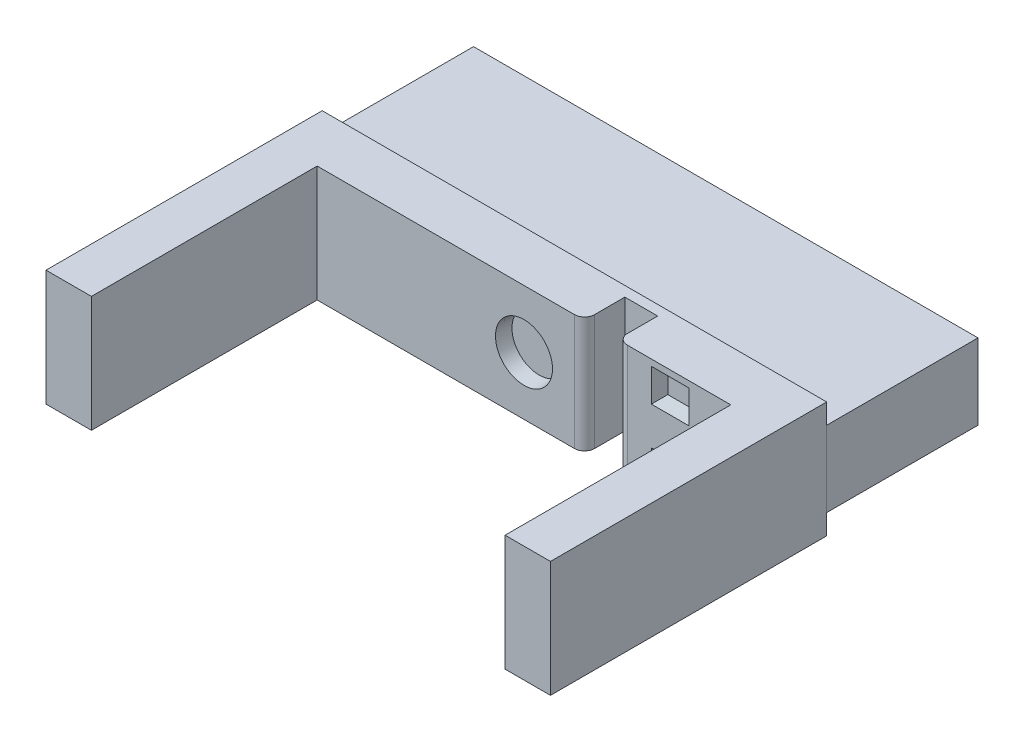
ISO-10303-21;
HEADER;
FILE_DESCRIPTION(('STEP AP214'),'2;1');
FILE_NAME('part.step','',(''),(''),'','','');
FILE_SCHEMA(('AUTOMOTIVE_DESIGN { 1 0 10303 214 1 1 1 1 }'));
ENDSEC;
DATA;
#1=APPLICATION_CONTEXT('core data for automotive mechanical design processes');
#2=APPLICATION_PROTOCOL_DEFINITION('international standard','automotive_design',2000,#1);
#3=PRODUCT_CONTEXT('',#1,'mechanical');
#4=PRODUCT('Part','Part','',(#3));
#5=PRODUCT_RELATED_PRODUCT_CATEGORY('part','',(#4));
#6=PRODUCT_DEFINITION_FORMATION('','',#4);
#7=PRODUCT_DEFINITION_CONTEXT('part definition',#1,'design');
#8=PRODUCT_DEFINITION('design','',#6,#7);
#9=PRODUCT_DEFINITION_SHAPE('','',#8);
#10=(LENGTH_UNIT() NAMED_UNIT(*) SI_UNIT(.MILLI.,.METRE.));
#11=(NAMED_UNIT(*) PLANE_ANGLE_UNIT() SI_UNIT($,.RADIAN.));
#12=(NAMED_UNIT(*) SI_UNIT($,.STERADIAN.) SOLID_ANGLE_UNIT());
#13=UNCERTAINTY_MEASURE_WITH_UNIT(LENGTH_MEASURE(1.E-05),#10,'distance_accuracy_value','');
#14=(GEOMETRIC_REPRESENTATION_CONTEXT(3) GLOBAL_UNCERTAINTY_ASSIGNED_CONTEXT((#13)) GLOBAL_UNIT_ASSIGNED_CONTEXT((#10,
#11,#12)) REPRESENTATION_CONTEXT('',''));
#15=CARTESIAN_POINT('',(0.,0.,0.));
#16=DIRECTION('',(0.,0.,1.));
#17=DIRECTION('',(1.,0.,0.));
#18=AXIS2_PLACEMENT_3D('',#15,#16,#17);
#19=CARTESIAN_POINT('',(0.,0.,40.));
#20=DIRECTION('',(0.,0.,1.));
#21=DIRECTION('',(1.,0.,0.));
#22=AXIS2_PLACEMENT_3D('',#19,#20,#21);
#23=PLANE('',#22);
#24=CARTESIAN_POINT('',(50.,-7.50000000000002,40.));
#25=DIRECTION('',(0.,0.,1.));
#26=DIRECTION('',(1.,0.,0.));
#27=AXIS2_PLACEMENT_3D('',#24,#25,#26);
#28=CIRCLE('',#27,5.64999999999999);
#29=CARTESIAN_POINT('',(55.65,-7.50000000000002,40.));
#30=VERTEX_POINT('',#29);
#31=EDGE_CURVE('E221',#30,#30,#28,.T.);
#32=ORIENTED_EDGE('',*,*,#31,.F.);
#33=EDGE_LOOP('',(#32));
#34=FACE_BOUND('',#33,.T.);
#35=DIRECTION('',(-1.,0.,0.));
#36=VECTOR('',#35,1.);
#37=CARTESIAN_POINT('',(100.,4.,40.));
#38=LINE('',#37,#36);
#39=CARTESIAN_POINT('',(60.,3.99999999999999,40.));
#40=VERTEX_POINT('',#39);
#41=CARTESIAN_POINT('',(9.00000000000001,3.99999999999999,40.));
#42=VERTEX_POINT('',#41);
#43=EDGE_CURVE('E332',#40,#42,#38,.T.);
#44=ORIENTED_EDGE('',*,*,#43,.T.);
#45=DIRECTION('',(0.,1.,0.));
#46=VECTOR('',#45,1.);
#47=CARTESIAN_POINT('',(9.,-19.,40.));
#48=LINE('',#47,#46);
#49=CARTESIAN_POINT('',(8.99999999999999,-19.,40.));
#50=VERTEX_POINT('',#49);
#51=EDGE_CURVE('E246',#50,#42,#48,.T.);
#52=ORIENTED_EDGE('',*,*,#51,.F.);
#53=DIRECTION('',(1.,0.,0.));
#54=VECTOR('',#53,1.);
#55=CARTESIAN_POINT('',(100.,-19.,40.));
#56=LINE('',#55,#54);
#57=CARTESIAN_POINT('',(60.,-19.,40.));
#58=VERTEX_POINT('',#57);
#59=EDGE_CURVE('E333',#50,#58,#56,.T.);
#60=ORIENTED_EDGE('',*,*,#59,.T.);
#61=DIRECTION('',(0.,-1.,0.));
#62=VECTOR('',#61,1.);
#63=CARTESIAN_POINT('',(60.,3.99999999999999,40.));
#64=LINE('',#63,#62);
#65=EDGE_CURVE('E363',#58,#40,#64,.F.);
#66=ORIENTED_EDGE('',*,*,#65,.T.);
#67=EDGE_LOOP('',(#44,#52,#60,#66));
#68=FACE_BOUND('',#67,.T.);
#69=ADVANCED_FACE('F43',(#34,#68),#23,.T.);
#70=DIRECTION('',(0.,-1.,0.));
#71=VECTOR('',#70,1.);
#72=CARTESIAN_POINT('',(75.25,-17.75,40.));
#73=LINE('',#72,#71);
#74=CARTESIAN_POINT('',(75.25,-11.25,40.));
#75=VERTEX_POINT('',#74);
#76=CARTESIAN_POINT('',(75.25,-17.75,40.));
#77=VERTEX_POINT('',#76);
#78=EDGE_CURVE('E58',#75,#77,#73,.T.);
#79=ORIENTED_EDGE('',*,*,#78,.F.);
#80=DIRECTION('',(-1.,0.,0.));
#81=VECTOR('',#80,1.);
#82=CARTESIAN_POINT('',(75.25,-11.25,40.));
#83=LINE('',#82,#81);
#84=CARTESIAN_POINT('',(82.75,-11.25,40.));
#85=VERTEX_POINT('',#84);
#86=EDGE_CURVE('E213',#85,#75,#83,.T.);
#87=ORIENTED_EDGE('',*,*,#86,.F.);
#88=DIRECTION('',(0.,1.,0.));
#89=VECTOR('',#88,1.);
#90=CARTESIAN_POINT('',(82.75,-17.75,40.));
#91=LINE('',#90,#89);
#92=CARTESIAN_POINT('',(82.75,-17.75,40.));
#93=VERTEX_POINT('',#92);
#94=EDGE_CURVE('E195',#93,#85,#91,.T.);
#95=ORIENTED_EDGE('',*,*,#94,.F.);
#96=DIRECTION('',(1.,0.,0.));
#97=VECTOR('',#96,1.);
#98=CARTESIAN_POINT('',(75.25,-17.75,40.));
#99=LINE('',#98,#97);
#100=EDGE_CURVE('E206',#77,#93,#99,.T.);
#101=ORIENTED_EDGE('',*,*,#100,.F.);
#102=EDGE_LOOP('',(#79,#87,#95,#101));
#103=FACE_BOUND('',#102,.T.);
#104=DIRECTION('',(0.,-1.,0.));
#105=VECTOR('',#104,1.);
#106=CARTESIAN_POINT('',(75.25,-3.75,40.));
#107=LINE('',#106,#105);
#108=CARTESIAN_POINT('',(75.25,2.75,40.));
#109=VERTEX_POINT('',#108);
#110=CARTESIAN_POINT('',(75.25,-3.75,40.));
#111=VERTEX_POINT('',#110);
#112=EDGE_CURVE('E66',#109,#111,#107,.T.);
#113=ORIENTED_EDGE('',*,*,#112,.F.);
#114=DIRECTION('',(-1.,0.,0.));
#115=VECTOR('',#114,1.);
#116=CARTESIAN_POINT('',(75.25,2.75,40.));
#117=LINE('',#116,#115);
#118=CARTESIAN_POINT('',(82.75,2.75,40.));
#119=VERTEX_POINT('',#118);
#120=EDGE_CURVE('E240',#119,#109,#117,.T.);
#121=ORIENTED_EDGE('',*,*,#120,.F.);
#122=DIRECTION('',(0.,1.,0.));
#123=VECTOR('',#122,1.);
#124=CARTESIAN_POINT('',(82.75,-3.75,40.));
#125=LINE('',#124,#123);
#126=CARTESIAN_POINT('',(82.75,-3.75,40.));
#127=VERTEX_POINT('',#126);
#128=EDGE_CURVE('E237',#127,#119,#125,.T.);
#129=ORIENTED_EDGE('',*,*,#128,.F.);
#130=DIRECTION('',(1.,0.,0.));
#131=VECTOR('',#130,1.);
#132=CARTESIAN_POINT('',(75.25,-3.75,40.));
#133=LINE('',#132,#131);
#134=EDGE_CURVE('E233',#111,#127,#133,.T.);
#135=ORIENTED_EDGE('',*,*,#134,.F.);
#136=EDGE_LOOP('',(#113,#121,#129,#135));
#137=FACE_BOUND('',#136,.T.);
#138=CARTESIAN_POINT('',(70.5,-19.,40.));
#139=VERTEX_POINT('',#138);
#140=CARTESIAN_POINT('',(91.,-19.,40.));
#141=VERTEX_POINT('',#140);
#142=EDGE_CURVE('E331',#139,#141,#56,.T.);
#143=ORIENTED_EDGE('',*,*,#142,.T.);
#144=DIRECTION('',(0.,-1.,0.));
#145=VECTOR('',#144,1.);
#146=CARTESIAN_POINT('',(91.,-19.,40.));
#147=LINE('',#146,#145);
#148=CARTESIAN_POINT('',(91.,4.,40.));
#149=VERTEX_POINT('',#148);
#150=EDGE_CURVE('E274',#149,#141,#147,.T.);
#151=ORIENTED_EDGE('',*,*,#150,.F.);
#152=CARTESIAN_POINT('',(70.5,3.99999999999999,40.));
#153=VERTEX_POINT('',#152);
#154=EDGE_CURVE('E329',#149,#153,#38,.T.);
#155=ORIENTED_EDGE('',*,*,#154,.T.);
#156=DIRECTION('',(0.,-1.,0.));
#157=VECTOR('',#156,1.);
#158=CARTESIAN_POINT('',(70.5,0.,40.));
#159=LINE('',#158,#157);
#160=EDGE_CURVE('E51',#153,#139,#159,.T.);
#161=ORIENTED_EDGE('',*,*,#160,.T.);
#162=EDGE_LOOP('',(#143,#151,#155,#161));
#163=FACE_BOUND('',#162,.T.);
#164=ADVANCED_FACE('F210',(#103,#137,#163),#23,.T.);
#165=CARTESIAN_POINT('',(100.,4.,40.));
#166=DIRECTION('',(0.,-1.,0.));
#167=DIRECTION('',(1.,0.,0.));
#168=AXIS2_PLACEMENT_3D('',#165,#166,#167);
#169=PLANE('',#168);
#170=ORIENTED_EDGE('',*,*,#43,.F.);
#171=CARTESIAN_POINT('',(60.,3.99999999999999,38.));
#172=DIRECTION('',(0.,-1.,0.));
#173=DIRECTION('',(1.,0.,0.));
#174=AXIS2_PLACEMENT_3D('',#171,#172,#173);
#175=CIRCLE('',#174,2.);
#176=CARTESIAN_POINT('',(62.,3.99999999999999,38.));
#177=VERTEX_POINT('',#176);
#178=EDGE_CURVE('E368',#40,#177,#175,.F.);
#179=ORIENTED_EDGE('',*,*,#178,.T.);
#180=DIRECTION('',(0.,0.,1.));
#181=VECTOR('',#180,1.);
#182=CARTESIAN_POINT('',(62.,3.99999999999999,32.));
#183=LINE('',#182,#181);
#184=CARTESIAN_POINT('',(62.,3.99999999999999,32.));
#185=VERTEX_POINT('',#184);
#186=EDGE_CURVE('E324',#185,#177,#183,.T.);
#187=ORIENTED_EDGE('',*,*,#186,.F.);
#188=DIRECTION('',(-1.,0.,0.));
#189=VECTOR('',#188,1.);
#190=CARTESIAN_POINT('',(0.,3.99999999999999,32.));
#191=LINE('',#190,#189);
#192=CARTESIAN_POINT('',(68.5,3.99999999999999,32.));
#193=VERTEX_POINT('',#192);
#194=EDGE_CURVE('E307',#193,#185,#191,.T.);
#195=ORIENTED_EDGE('',*,*,#194,.F.);
#196=DIRECTION('',(0.,0.,1.));
#197=VECTOR('',#196,1.);
#198=CARTESIAN_POINT('',(68.5,3.99999999999999,32.));
#199=LINE('',#198,#197);
#200=CARTESIAN_POINT('',(68.5,3.99999999999999,38.));
#201=VERTEX_POINT('',#200);
#202=EDGE_CURVE('E316',#193,#201,#199,.T.);
#203=ORIENTED_EDGE('',*,*,#202,.T.);
#204=CARTESIAN_POINT('',(70.5,3.99999999999999,38.));
#205=DIRECTION('',(0.,-1.,0.));
#206=DIRECTION('',(1.,0.,0.));
#207=AXIS2_PLACEMENT_3D('',#204,#205,#206);
#208=CIRCLE('',#207,2.);
#209=EDGE_CURVE('E365',#201,#153,#208,.F.);
#210=ORIENTED_EDGE('',*,*,#209,.T.);
#211=ORIENTED_EDGE('',*,*,#154,.F.);
#212=DIRECTION('',(0.,0.,-1.));
#213=VECTOR('',#212,1.);
#214=CARTESIAN_POINT('',(91.,4.,109.698178070457));
#215=LINE('',#214,#213);
#216=CARTESIAN_POINT('',(91.,4.,84.7499999999998));
#217=VERTEX_POINT('',#216);
#218=EDGE_CURVE('E301',#217,#149,#215,.T.);
#219=ORIENTED_EDGE('',*,*,#218,.F.);
#220=DIRECTION('',(1.,0.,0.));
#221=VECTOR('',#220,1.);
#222=CARTESIAN_POINT('',(100.,4.,84.7499999999998));
#223=LINE('',#222,#221);
#224=CARTESIAN_POINT('',(100.,4.,84.7499999999998));
#225=VERTEX_POINT('',#224);
#226=EDGE_CURVE('E288',#217,#225,#223,.T.);
#227=ORIENTED_EDGE('',*,*,#226,.T.);
#228=DIRECTION('',(0.,0.,-1.));
#229=VECTOR('',#228,1.);
#230=CARTESIAN_POINT('',(100.,4.,40.));
#231=LINE('',#230,#229);
#232=CARTESIAN_POINT('',(100.,4.,30.));
#233=VERTEX_POINT('',#232);
#234=EDGE_CURVE('E352',#225,#233,#231,.T.);
#235=ORIENTED_EDGE('',*,*,#234,.T.);
#236=DIRECTION('',(-1.,0.,0.));
#237=VECTOR('',#236,1.);
#238=CARTESIAN_POINT('',(100.,4.,30.));
#239=LINE('',#238,#237);
#240=CARTESIAN_POINT('',(0.,3.99999999999999,30.));
#241=VERTEX_POINT('',#240);
#242=EDGE_CURVE('E338',#233,#241,#239,.T.);
#243=ORIENTED_EDGE('',*,*,#242,.T.);
#244=DIRECTION('',(0.,0.,-1.));
#245=VECTOR('',#244,1.);
#246=CARTESIAN_POINT('',(0.,3.99999999999999,40.));
#247=LINE('',#246,#245);
#248=CARTESIAN_POINT('',(0.,3.99999999999999,84.7499999999998));
#249=VERTEX_POINT('',#248);
#250=EDGE_CURVE('E349',#249,#241,#247,.T.);
#251=ORIENTED_EDGE('',*,*,#250,.F.);
#252=DIRECTION('',(1.,0.,0.));
#253=VECTOR('',#252,1.);
#254=CARTESIAN_POINT('',(0.,3.99999999999999,84.7499999999998));
#255=LINE('',#254,#253);
#256=CARTESIAN_POINT('',(9.,3.99999999999999,84.7499999999998));
#257=VERTEX_POINT('',#256);
#258=EDGE_CURVE('E268',#249,#257,#255,.T.);
#259=ORIENTED_EDGE('',*,*,#258,.T.);
#260=DIRECTION('',(0.,0.,-1.));
#261=VECTOR('',#260,1.);
#262=CARTESIAN_POINT('',(9.,3.99999999999999,109.698178070457));
#263=LINE('',#262,#261);
#264=EDGE_CURVE('E277',#257,#42,#263,.T.);
#265=ORIENTED_EDGE('',*,*,#264,.T.);
#266=EDGE_LOOP('',(#170,#179,#187,#195,#203,#210,#211,#219,#227,#235,#243,#251,#259,#265));
#267=FACE_BOUND('',#266,.T.);
#268=ADVANCED_FACE('F386',(#267),#169,.F.);
#269=CARTESIAN_POINT('',(100.,-19.,40.));
#270=DIRECTION('',(0.,1.,0.));
#271=DIRECTION('',(-1.,0.,0.));
#272=AXIS2_PLACEMENT_3D('',#269,#270,#271);
#273=PLANE('',#272);
#274=DIRECTION('',(0.,0.,1.));
#275=VECTOR('',#274,1.);
#276=CARTESIAN_POINT('',(62.,-19.,32.));
#277=LINE('',#276,#275);
#278=CARTESIAN_POINT('',(62.,-19.,32.));
#279=VERTEX_POINT('',#278);
#280=CARTESIAN_POINT('',(62.,-19.,38.));
#281=VERTEX_POINT('',#280);
#282=EDGE_CURVE('E321',#279,#281,#277,.T.);
#283=ORIENTED_EDGE('',*,*,#282,.T.);
#284=CARTESIAN_POINT('',(60.,-19.,38.));
#285=DIRECTION('',(0.,1.,0.));
#286=DIRECTION('',(-1.,0.,0.));
#287=AXIS2_PLACEMENT_3D('',#284,#285,#286);
#288=CIRCLE('',#287,2.);
#289=EDGE_CURVE('E360',#281,#58,#288,.F.);
#290=ORIENTED_EDGE('',*,*,#289,.T.);
#291=ORIENTED_EDGE('',*,*,#59,.F.);
#292=DIRECTION('',(0.,0.,-1.));
#293=VECTOR('',#292,1.);
#294=CARTESIAN_POINT('',(9.,-19.,109.698178070457));
#295=LINE('',#294,#293);
#296=CARTESIAN_POINT('',(9.,-19.,84.7499999999998));
#297=VERTEX_POINT('',#296);
#298=EDGE_CURVE('E280',#297,#50,#295,.T.);
#299=ORIENTED_EDGE('',*,*,#298,.F.);
#300=DIRECTION('',(-1.,0.,0.));
#301=VECTOR('',#300,1.);
#302=CARTESIAN_POINT('',(0.,-19.,84.7499999999998));
#303=LINE('',#302,#301);
#304=CARTESIAN_POINT('',(0.,-19.,84.7499999999998));
#305=VERTEX_POINT('',#304);
#306=EDGE_CURVE('E267',#297,#305,#303,.T.);
#307=ORIENTED_EDGE('',*,*,#306,.T.);
#308=DIRECTION('',(0.,0.,-1.));
#309=VECTOR('',#308,1.);
#310=CARTESIAN_POINT('',(0.,-19.,40.));
#311=LINE('',#310,#309);
#312=CARTESIAN_POINT('',(0.,-19.,30.));
#313=VERTEX_POINT('',#312);
#314=EDGE_CURVE('E346',#305,#313,#311,.T.);
#315=ORIENTED_EDGE('',*,*,#314,.T.);
#316=DIRECTION('',(1.,0.,0.));
#317=VECTOR('',#316,1.);
#318=CARTESIAN_POINT('',(100.,-19.,30.));
#319=LINE('',#318,#317);
#320=CARTESIAN_POINT('',(100.,-19.,30.));
#321=VERTEX_POINT('',#320);
#322=EDGE_CURVE('E342',#313,#321,#319,.T.);
#323=ORIENTED_EDGE('',*,*,#322,.T.);
#324=DIRECTION('',(0.,0.,-1.));
#325=VECTOR('',#324,1.);
#326=CARTESIAN_POINT('',(100.,-19.,40.));
#327=LINE('',#326,#325);
#328=CARTESIAN_POINT('',(100.,-19.,84.7499999999998));
#329=VERTEX_POINT('',#328);
#330=EDGE_CURVE('E335',#329,#321,#327,.T.);
#331=ORIENTED_EDGE('',*,*,#330,.F.);
#332=DIRECTION('',(-1.,0.,0.));
#333=VECTOR('',#332,1.);
#334=CARTESIAN_POINT('',(100.,-19.,84.7499999999998));
#335=LINE('',#334,#333);
#336=CARTESIAN_POINT('',(91.,-19.,84.7499999999998));
#337=VERTEX_POINT('',#336);
#338=EDGE_CURVE('E289',#329,#337,#335,.T.);
#339=ORIENTED_EDGE('',*,*,#338,.T.);
#340=DIRECTION('',(0.,0.,-1.));
#341=VECTOR('',#340,1.);
#342=CARTESIAN_POINT('',(91.,-19.,109.698178070457));
#343=LINE('',#342,#341);
#344=EDGE_CURVE('E298',#337,#141,#343,.T.);
#345=ORIENTED_EDGE('',*,*,#344,.T.);
#346=ORIENTED_EDGE('',*,*,#142,.F.);
#347=CARTESIAN_POINT('',(70.5,-19.,38.));
#348=DIRECTION('',(0.,1.,0.));
#349=DIRECTION('',(-1.,0.,0.));
#350=AXIS2_PLACEMENT_3D('',#347,#348,#349);
#351=CIRCLE('',#350,2.);
#352=CARTESIAN_POINT('',(68.5,-19.,38.));
#353=VERTEX_POINT('',#352);
#354=EDGE_CURVE('E358',#139,#353,#351,.F.);
#355=ORIENTED_EDGE('',*,*,#354,.T.);
#356=DIRECTION('',(0.,0.,1.));
#357=VECTOR('',#356,1.);
#358=CARTESIAN_POINT('',(68.5,-19.,32.));
#359=LINE('',#358,#357);
#360=CARTESIAN_POINT('',(68.5,-19.,32.));
#361=VERTEX_POINT('',#360);
#362=EDGE_CURVE('E317',#361,#353,#359,.T.);
#363=ORIENTED_EDGE('',*,*,#362,.F.);
#364=DIRECTION('',(1.,0.,0.));
#365=VECTOR('',#364,1.);
#366=CARTESIAN_POINT('',(0.,-19.,32.));
#367=LINE('',#366,#365);
#368=EDGE_CURVE('E313',#279,#361,#367,.T.);
#369=ORIENTED_EDGE('',*,*,#368,.F.);
#370=EDGE_LOOP('',(#283,#290,#291,#299,#307,#315,#323,#331,#339,#345,#346,#355,#363,#369));
#371=FACE_BOUND('',#370,.T.);
#372=ADVANCED_FACE('F377',(#371),#273,.F.);
#373=CARTESIAN_POINT('',(100.,-19.,40.));
#374=DIRECTION('',(-1.,0.,0.));
#375=DIRECTION('',(0.,0.,1.));
#376=AXIS2_PLACEMENT_3D('',#373,#374,#375);
#377=PLANE('',#376);
#378=DIRECTION('',(0.,1.,0.));
#379=VECTOR('',#378,1.);
#380=CARTESIAN_POINT('',(100.,-19.,30.));
#381=LINE('',#380,#379);
#382=EDGE_CURVE('E320',#321,#233,#381,.T.);
#383=ORIENTED_EDGE('',*,*,#382,.T.);
#384=ORIENTED_EDGE('',*,*,#234,.F.);
#385=DIRECTION('',(0.,-1.,0.));
#386=VECTOR('',#385,1.);
#387=CARTESIAN_POINT('',(100.,-19.,84.7499999999998));
#388=LINE('',#387,#386);
#389=EDGE_CURVE('E292',#225,#329,#388,.T.);
#390=ORIENTED_EDGE('',*,*,#389,.T.);
#391=ORIENTED_EDGE('',*,*,#330,.T.);
#392=EDGE_LOOP('',(#383,#384,#390,#391));
#393=FACE_BOUND('',#392,.T.);
#394=ADVANCED_FACE('F420',(#393),#377,.F.);
#395=CARTESIAN_POINT('',(0.,-19.,40.));
#396=DIRECTION('',(1.,0.,0.));
#397=DIRECTION('',(0.,1.,0.));
#398=AXIS2_PLACEMENT_3D('',#395,#396,#397);
#399=PLANE('',#398);
#400=DIRECTION('',(0.,-1.,0.));
#401=VECTOR('',#400,1.);
#402=CARTESIAN_POINT('',(0.,-19.,30.));
#403=LINE('',#402,#401);
#404=EDGE_CURVE('E340',#241,#313,#403,.T.);
#405=ORIENTED_EDGE('',*,*,#404,.T.);
#406=ORIENTED_EDGE('',*,*,#314,.F.);
#407=DIRECTION('',(0.,1.,0.));
#408=VECTOR('',#407,1.);
#409=CARTESIAN_POINT('',(0.,-19.,84.7499999999998));
#410=LINE('',#409,#408);
#411=EDGE_CURVE('E271',#305,#249,#410,.T.);
#412=ORIENTED_EDGE('',*,*,#411,.T.);
#413=ORIENTED_EDGE('',*,*,#250,.T.);
#414=EDGE_LOOP('',(#405,#406,#412,#413));
#415=FACE_BOUND('',#414,.T.);
#416=ADVANCED_FACE('F424',(#415),#399,.F.);
#417=CARTESIAN_POINT('',(0.,0.,30.));
#418=DIRECTION('',(0.,0.,1.));
#419=DIRECTION('',(1.,0.,0.));
#420=AXIS2_PLACEMENT_3D('',#417,#418,#419);
#421=PLANE('',#420);
#422=ORIENTED_EDGE('',*,*,#382,.F.);
#423=ORIENTED_EDGE('',*,*,#322,.F.);
#424=ORIENTED_EDGE('',*,*,#404,.F.);
#425=ORIENTED_EDGE('',*,*,#242,.F.);
#426=EDGE_LOOP('',(#422,#423,#424,#425));
#427=FACE_BOUND('',#426,.T.);
#428=ADVANCED_FACE('F418',(#427),#421,.F.);
#429=CARTESIAN_POINT('',(68.5,0.,32.));
#430=DIRECTION('',(-1.,0.,0.));
#431=DIRECTION('',(0.,-1.,0.));
#432=AXIS2_PLACEMENT_3D('',#429,#430,#431);
#433=PLANE('',#432);
#434=ORIENTED_EDGE('',*,*,#362,.T.);
#435=DIRECTION('',(0.,-1.,0.));
#436=VECTOR('',#435,1.);
#437=CARTESIAN_POINT('',(68.5,0.,38.));
#438=LINE('',#437,#436);
#439=EDGE_CURVE('E13',#353,#201,#438,.F.);
#440=ORIENTED_EDGE('',*,*,#439,.T.);
#441=ORIENTED_EDGE('',*,*,#202,.F.);
#442=DIRECTION('',(0.,-1.,0.));
#443=VECTOR('',#442,1.);
#444=CARTESIAN_POINT('',(68.5,0.,32.));
#445=LINE('',#444,#443);
#446=EDGE_CURVE('E295',#193,#361,#445,.T.);
#447=ORIENTED_EDGE('',*,*,#446,.T.);
#448=EDGE_LOOP('',(#434,#440,#441,#447));
#449=FACE_BOUND('',#448,.T.);
#450=ADVANCED_FACE('F390',(#449),#433,.T.);
#451=CARTESIAN_POINT('',(62.,0.,32.));
#452=DIRECTION('',(-1.,0.,0.));
#453=DIRECTION('',(0.,0.,1.));
#454=AXIS2_PLACEMENT_3D('',#451,#452,#453);
#455=PLANE('',#454);
#456=ORIENTED_EDGE('',*,*,#186,.T.);
#457=DIRECTION('',(0.,-1.,0.));
#458=VECTOR('',#457,1.);
#459=CARTESIAN_POINT('',(62.,-19.,38.));
#460=LINE('',#459,#458);
#461=EDGE_CURVE('E355',#177,#281,#460,.T.);
#462=ORIENTED_EDGE('',*,*,#461,.T.);
#463=ORIENTED_EDGE('',*,*,#282,.F.);
#464=DIRECTION('',(0.,-1.,0.));
#465=VECTOR('',#464,1.);
#466=CARTESIAN_POINT('',(62.,0.,32.));
#467=LINE('',#466,#465);
#468=EDGE_CURVE('E310',#185,#279,#467,.T.);
#469=ORIENTED_EDGE('',*,*,#468,.F.);
#470=EDGE_LOOP('',(#456,#462,#463,#469));
#471=FACE_BOUND('',#470,.T.);
#472=ADVANCED_FACE('F397',(#471),#455,.F.);
#473=CARTESIAN_POINT('',(0.,0.,32.));
#474=DIRECTION('',(0.,0.,1.));
#475=DIRECTION('',(1.,0.,0.));
#476=AXIS2_PLACEMENT_3D('',#473,#474,#475);
#477=PLANE('',#476);
#478=ORIENTED_EDGE('',*,*,#446,.F.);
#479=ORIENTED_EDGE('',*,*,#194,.T.);
#480=ORIENTED_EDGE('',*,*,#468,.T.);
#481=ORIENTED_EDGE('',*,*,#368,.T.);
#482=EDGE_LOOP('',(#478,#479,#480,#481));
#483=FACE_BOUND('',#482,.T.);
#484=ADVANCED_FACE('F394',(#483),#477,.T.);
#485=CARTESIAN_POINT('',(60.,0.,38.));
#486=DIRECTION('',(0.,1.,0.));
#487=DIRECTION('',(0.,0.,1.));
#488=AXIS2_PLACEMENT_3D('',#485,#486,#487);
#489=CYLINDRICAL_SURFACE('',#488,2.);
#490=ORIENTED_EDGE('',*,*,#178,.F.);
#491=ORIENTED_EDGE('',*,*,#65,.F.);
#492=ORIENTED_EDGE('',*,*,#289,.F.);
#493=ORIENTED_EDGE('',*,*,#461,.F.);
#494=EDGE_LOOP('',(#490,#491,#492,#493));
#495=FACE_BOUND('',#494,.T.);
#496=ADVANCED_FACE('F401',(#495),#489,.T.);
#497=CARTESIAN_POINT('',(70.5,0.,38.));
#498=DIRECTION('',(0.,-1.,0.));
#499=DIRECTION('',(1.,0.,0.));
#500=AXIS2_PLACEMENT_3D('',#497,#498,#499);
#501=CYLINDRICAL_SURFACE('',#500,2.);
#502=ORIENTED_EDGE('',*,*,#209,.F.);
#503=ORIENTED_EDGE('',*,*,#439,.F.);
#504=ORIENTED_EDGE('',*,*,#354,.F.);
#505=ORIENTED_EDGE('',*,*,#160,.F.);
#506=EDGE_LOOP('',(#502,#503,#504,#505));
#507=FACE_BOUND('',#506,.T.);
#508=ADVANCED_FACE('F45',(#507),#501,.T.);
#509=CARTESIAN_POINT('',(91.,-19.,109.698178070457));
#510=DIRECTION('',(1.,0.,0.));
#511=DIRECTION('',(0.,0.,-1.));
#512=AXIS2_PLACEMENT_3D('',#509,#510,#511);
#513=PLANE('',#512);
#514=ORIENTED_EDGE('',*,*,#344,.F.);
#515=DIRECTION('',(0.,1.,0.));
#516=VECTOR('',#515,1.);
#517=CARTESIAN_POINT('',(91.,-19.,84.7499999999998));
#518=LINE('',#517,#516);
#519=EDGE_CURVE('E285',#337,#217,#518,.T.);
#520=ORIENTED_EDGE('',*,*,#519,.T.);
#521=ORIENTED_EDGE('',*,*,#218,.T.);
#522=ORIENTED_EDGE('',*,*,#150,.T.);
#523=EDGE_LOOP('',(#514,#520,#521,#522));
#524=FACE_BOUND('',#523,.T.);
#525=ADVANCED_FACE('F382',(#524),#513,.F.);
#526=CARTESIAN_POINT('',(36.6003476417353,7.99340939817927,84.7499999999998));
#527=DIRECTION('',(0.,0.,-1.));
#528=DIRECTION('',(0.,-1.,0.));
#529=AXIS2_PLACEMENT_3D('',#526,#527,#528);
#530=PLANE('',#529);
#531=ORIENTED_EDGE('',*,*,#226,.F.);
#532=ORIENTED_EDGE('',*,*,#519,.F.);
#533=ORIENTED_EDGE('',*,*,#338,.F.);
#534=ORIENTED_EDGE('',*,*,#389,.F.);
#535=EDGE_LOOP('',(#531,#532,#533,#534));
#536=FACE_BOUND('',#535,.T.);
#537=ADVANCED_FACE('F423',(#536),#530,.F.);
#538=CARTESIAN_POINT('',(9.,-19.,109.698178070457));
#539=DIRECTION('',(-1.,0.,0.));
#540=DIRECTION('',(0.,-1.,0.));
#541=AXIS2_PLACEMENT_3D('',#538,#539,#540);
#542=PLANE('',#541);
#543=ORIENTED_EDGE('',*,*,#264,.F.);
#544=DIRECTION('',(0.,-1.,0.));
#545=VECTOR('',#544,1.);
#546=CARTESIAN_POINT('',(9.,-19.,84.7499999999998));
#547=LINE('',#546,#545);
#548=EDGE_CURVE('E264',#257,#297,#547,.T.);
#549=ORIENTED_EDGE('',*,*,#548,.T.);
#550=ORIENTED_EDGE('',*,*,#298,.T.);
#551=ORIENTED_EDGE('',*,*,#51,.T.);
#552=EDGE_LOOP('',(#543,#549,#550,#551));
#553=FACE_BOUND('',#552,.T.);
#554=ADVANCED_FACE('F408',(#553),#542,.F.);
#555=CARTESIAN_POINT('',(36.6003476417353,7.99340939817927,84.7499999999998));
#556=DIRECTION('',(0.,0.,-1.));
#557=DIRECTION('',(0.,-1.,0.));
#558=AXIS2_PLACEMENT_3D('',#555,#556,#557);
#559=PLANE('',#558);
#560=ORIENTED_EDGE('',*,*,#306,.F.);
#561=ORIENTED_EDGE('',*,*,#548,.F.);
#562=ORIENTED_EDGE('',*,*,#258,.F.);
#563=ORIENTED_EDGE('',*,*,#411,.F.);
#564=EDGE_LOOP('',(#560,#561,#562,#563));
#565=FACE_BOUND('',#564,.T.);
#566=ADVANCED_FACE('F411',(#565),#559,.F.);
#567=CARTESIAN_POINT('',(75.25,-3.75,40.));
#568=DIRECTION('',(-0.996194698091746,0.,-0.0871557427476582));
#569=DIRECTION('',(-0.0871557427476582,0.,0.996194698091746));
#570=AXIS2_PLACEMENT_3D('',#567,#568,#569);
#571=PLANE('',#570);
#572=ORIENTED_EDGE('',*,*,#112,.T.);
#573=DIRECTION('',(-0.0868265938642476,-0.0868265938642476,0.992432509138967));
#574=VECTOR('',#573,1.);
#575=CARTESIAN_POINT('',(75.25,-3.75,40.));
#576=LINE('',#575,#574);
#577=CARTESIAN_POINT('',(75.5124659905778,-3.48753400942223,37.));
#578=VERTEX_POINT('',#577);
#579=EDGE_CURVE('E248',#578,#111,#576,.T.);
#580=ORIENTED_EDGE('',*,*,#579,.F.);
#581=DIRECTION('',(0.,-1.,0.));
#582=VECTOR('',#581,1.);
#583=CARTESIAN_POINT('',(75.5124659905778,-3.75,37.));
#584=LINE('',#583,#582);
#585=CARTESIAN_POINT('',(75.5124659905778,2.48753400942223,37.));
#586=VERTEX_POINT('',#585);
#587=EDGE_CURVE('E243',#586,#578,#584,.T.);
#588=ORIENTED_EDGE('',*,*,#587,.F.);
#589=DIRECTION('',(-0.0868265938642476,0.0868265938642476,0.992432509138967));
#590=VECTOR('',#589,1.);
#591=CARTESIAN_POINT('',(75.25,2.75,40.));
#592=LINE('',#591,#590);
#593=EDGE_CURVE('E244',#586,#109,#592,.T.);
#594=ORIENTED_EDGE('',*,*,#593,.T.);
#595=EDGE_LOOP('',(#572,#580,#588,#594));
#596=FACE_BOUND('',#595,.T.);
#597=ADVANCED_FACE('F468',(#596),#571,.F.);
#598=CARTESIAN_POINT('',(75.25,2.75,40.));
#599=DIRECTION('',(0.,0.996194698091746,-0.0871557427476582));
#600=DIRECTION('',(0.,0.0871557427476582,0.996194698091746));
#601=AXIS2_PLACEMENT_3D('',#598,#599,#600);
#602=PLANE('',#601);
#603=ORIENTED_EDGE('',*,*,#120,.T.);
#604=ORIENTED_EDGE('',*,*,#593,.F.);
#605=DIRECTION('',(-1.,0.,0.));
#606=VECTOR('',#605,1.);
#607=CARTESIAN_POINT('',(75.25,2.48753400942223,37.));
#608=LINE('',#607,#606);
#609=CARTESIAN_POINT('',(82.4875340094222,2.48753400942223,37.));
#610=VERTEX_POINT('',#609);
#611=EDGE_CURVE('E251',#610,#586,#608,.T.);
#612=ORIENTED_EDGE('',*,*,#611,.F.);
#613=DIRECTION('',(0.0868265938642476,0.0868265938642476,0.992432509138967));
#614=VECTOR('',#613,1.);
#615=CARTESIAN_POINT('',(82.7009974268866,2.70099742688657,39.4398980263435));
#616=LINE('',#615,#614);
#617=EDGE_CURVE('E247',#610,#119,#616,.T.);
#618=ORIENTED_EDGE('',*,*,#617,.T.);
#619=EDGE_LOOP('',(#603,#604,#612,#618));
#620=FACE_BOUND('',#619,.T.);
#621=ADVANCED_FACE('F469',(#620),#602,.F.);
#622=CARTESIAN_POINT('',(82.75,-3.75,40.));
#623=DIRECTION('',(0.996194698091746,0.,-0.0871557427476582));
#624=DIRECTION('',(-0.0871557427476582,0.,-0.996194698091746));
#625=AXIS2_PLACEMENT_3D('',#622,#623,#624);
#626=PLANE('',#625);
#627=ORIENTED_EDGE('',*,*,#128,.T.);
#628=ORIENTED_EDGE('',*,*,#617,.F.);
#629=DIRECTION('',(0.,1.,0.));
#630=VECTOR('',#629,1.);
#631=CARTESIAN_POINT('',(82.4875340094222,-3.75,37.));
#632=LINE('',#631,#630);
#633=CARTESIAN_POINT('',(82.4875340094222,-3.48753400942223,37.));
#634=VERTEX_POINT('',#633);
#635=EDGE_CURVE('E259',#634,#610,#632,.T.);
#636=ORIENTED_EDGE('',*,*,#635,.F.);
#637=DIRECTION('',(0.0868265938642476,-0.0868265938642476,0.992432509138967));
#638=VECTOR('',#637,1.);
#639=CARTESIAN_POINT('',(82.6934585694845,-3.6934585694845,39.3537284919349));
#640=LINE('',#639,#638);
#641=EDGE_CURVE('E250',#634,#127,#640,.T.);
#642=ORIENTED_EDGE('',*,*,#641,.T.);
#643=EDGE_LOOP('',(#627,#628,#636,#642));
#644=FACE_BOUND('',#643,.T.);
#645=ADVANCED_FACE('F472',(#644),#626,.F.);
#646=CARTESIAN_POINT('',(75.25,-3.75,40.));
#647=DIRECTION('',(0.,-0.996194698091746,-0.0871557427476582));
#648=DIRECTION('',(0.,0.0871557427476582,-0.996194698091746));
#649=AXIS2_PLACEMENT_3D('',#646,#647,#648);
#650=PLANE('',#649);
#651=ORIENTED_EDGE('',*,*,#134,.T.);
#652=ORIENTED_EDGE('',*,*,#641,.F.);
#653=DIRECTION('',(1.,0.,0.));
#654=VECTOR('',#653,1.);
#655=CARTESIAN_POINT('',(75.25,-3.48753400942223,37.));
#656=LINE('',#655,#654);
#657=EDGE_CURVE('E256',#578,#634,#656,.T.);
#658=ORIENTED_EDGE('',*,*,#657,.F.);
#659=ORIENTED_EDGE('',*,*,#579,.T.);
#660=EDGE_LOOP('',(#651,#652,#658,#659));
#661=FACE_BOUND('',#660,.T.);
#662=ADVANCED_FACE('F476',(#661),#650,.F.);
#663=CARTESIAN_POINT('',(0.,0.,37.));
#664=DIRECTION('',(0.,0.,-1.));
#665=DIRECTION('',(-1.,0.,0.));
#666=AXIS2_PLACEMENT_3D('',#663,#664,#665);
#667=PLANE('',#666);
#668=ORIENTED_EDGE('',*,*,#587,.T.);
#669=ORIENTED_EDGE('',*,*,#657,.T.);
#670=ORIENTED_EDGE('',*,*,#635,.T.);
#671=ORIENTED_EDGE('',*,*,#611,.T.);
#672=EDGE_LOOP('',(#668,#669,#670,#671));
#673=FACE_BOUND('',#672,.T.);
#674=ADVANCED_FACE('F480',(#673),#667,.F.);
#675=CARTESIAN_POINT('',(75.25,-17.75,40.));
#676=DIRECTION('',(-0.996194698091745,0.,-0.0871557427476582));
#677=DIRECTION('',(-0.0871557427476582,0.,0.996194698091746));
#678=AXIS2_PLACEMENT_3D('',#675,#676,#677);
#679=PLANE('',#678);
#680=ORIENTED_EDGE('',*,*,#78,.T.);
#681=DIRECTION('',(-0.0868265938642476,-0.0868265938642476,0.992432509138967));
#682=VECTOR('',#681,1.);
#683=CARTESIAN_POINT('',(75.25,-17.75,40.));
#684=LINE('',#683,#682);
#685=CARTESIAN_POINT('',(75.5124659905778,-17.4875340094222,37.));
#686=VERTEX_POINT('',#685);
#687=EDGE_CURVE('E203',#686,#77,#684,.T.);
#688=ORIENTED_EDGE('',*,*,#687,.F.);
#689=DIRECTION('',(0.,-1.,0.));
#690=VECTOR('',#689,1.);
#691=CARTESIAN_POINT('',(75.5124659905778,-17.75,37.));
#692=LINE('',#691,#690);
#693=CARTESIAN_POINT('',(75.5124659905778,-11.5124659905778,37.));
#694=VERTEX_POINT('',#693);
#695=EDGE_CURVE('E215',#694,#686,#692,.T.);
#696=ORIENTED_EDGE('',*,*,#695,.F.);
#697=DIRECTION('',(-0.0868265938642476,0.0868265938642476,0.992432509138967));
#698=VECTOR('',#697,1.);
#699=CARTESIAN_POINT('',(75.25,-11.25,40.));
#700=LINE('',#699,#698);
#701=EDGE_CURVE('E219',#694,#75,#700,.T.);
#702=ORIENTED_EDGE('',*,*,#701,.T.);
#703=EDGE_LOOP('',(#680,#688,#696,#702));
#704=FACE_BOUND('',#703,.T.);
#705=ADVANCED_FACE('F486',(#704),#679,.F.);
#706=CARTESIAN_POINT('',(75.25,-11.25,40.));
#707=DIRECTION('',(0.,0.996194698091746,-0.0871557427476582));
#708=DIRECTION('',(0.,0.0871557427476582,0.996194698091746));
#709=AXIS2_PLACEMENT_3D('',#706,#707,#708);
#710=PLANE('',#709);
#711=ORIENTED_EDGE('',*,*,#86,.T.);
#712=ORIENTED_EDGE('',*,*,#701,.F.);
#713=DIRECTION('',(-1.,0.,0.));
#714=VECTOR('',#713,1.);
#715=CARTESIAN_POINT('',(75.25,-11.5124659905778,37.));
#716=LINE('',#715,#714);
#717=CARTESIAN_POINT('',(82.4875340094222,-11.5124659905778,37.));
#718=VERTEX_POINT('',#717);
#719=EDGE_CURVE('E222',#718,#694,#716,.T.);
#720=ORIENTED_EDGE('',*,*,#719,.F.);
#721=DIRECTION('',(0.0868265938642476,0.0868265938642476,0.992432509138967));
#722=VECTOR('',#721,1.);
#723=CARTESIAN_POINT('',(82.7009974268866,-11.2990025731134,39.4398980263435));
#724=LINE('',#723,#722);
#725=EDGE_CURVE('E202',#718,#85,#724,.T.);
#726=ORIENTED_EDGE('',*,*,#725,.T.);
#727=EDGE_LOOP('',(#711,#712,#720,#726));
#728=FACE_BOUND('',#727,.T.);
#729=ADVANCED_FACE('F488',(#728),#710,.F.);
#730=CARTESIAN_POINT('',(82.75,-17.75,40.));
#731=DIRECTION('',(0.996194698091745,0.,-0.0871557427476582));
#732=DIRECTION('',(-0.0871557427476582,0.,-0.996194698091746));
#733=AXIS2_PLACEMENT_3D('',#730,#731,#732);
#734=PLANE('',#733);
#735=ORIENTED_EDGE('',*,*,#94,.T.);
#736=ORIENTED_EDGE('',*,*,#725,.F.);
#737=DIRECTION('',(0.,1.,0.));
#738=VECTOR('',#737,1.);
#739=CARTESIAN_POINT('',(82.4875340094222,-17.75,37.));
#740=LINE('',#739,#738);
#741=CARTESIAN_POINT('',(82.4875340094222,-17.4875340094222,37.));
#742=VERTEX_POINT('',#741);
#743=EDGE_CURVE('E198',#742,#718,#740,.T.);
#744=ORIENTED_EDGE('',*,*,#743,.F.);
#745=DIRECTION('',(0.0868265938642476,-0.0868265938642476,0.992432509138967));
#746=VECTOR('',#745,1.);
#747=CARTESIAN_POINT('',(82.6934585694845,-17.6934585694845,39.3537284919349));
#748=LINE('',#747,#746);
#749=EDGE_CURVE('E191',#742,#93,#748,.T.);
#750=ORIENTED_EDGE('',*,*,#749,.T.);
#751=EDGE_LOOP('',(#735,#736,#744,#750));
#752=FACE_BOUND('',#751,.T.);
#753=ADVANCED_FACE('F193',(#752),#734,.F.);
#754=CARTESIAN_POINT('',(75.25,-17.75,40.));
#755=DIRECTION('',(0.,-0.996194698091746,-0.0871557427476582));
#756=DIRECTION('',(0.,0.0871557427476582,-0.996194698091746));
#757=AXIS2_PLACEMENT_3D('',#754,#755,#756);
#758=PLANE('',#757);
#759=ORIENTED_EDGE('',*,*,#100,.T.);
#760=ORIENTED_EDGE('',*,*,#749,.F.);
#761=DIRECTION('',(1.,0.,0.));
#762=VECTOR('',#761,1.);
#763=CARTESIAN_POINT('',(75.25,-17.4875340094222,37.));
#764=LINE('',#763,#762);
#765=EDGE_CURVE('E227',#686,#742,#764,.T.);
#766=ORIENTED_EDGE('',*,*,#765,.F.);
#767=ORIENTED_EDGE('',*,*,#687,.T.);
#768=EDGE_LOOP('',(#759,#760,#766,#767));
#769=FACE_BOUND('',#768,.T.);
#770=ADVANCED_FACE('F207',(#769),#758,.F.);
#771=CARTESIAN_POINT('',(0.,0.,37.));
#772=DIRECTION('',(0.,0.,-1.));
#773=DIRECTION('',(-1.,0.,0.));
#774=AXIS2_PLACEMENT_3D('',#771,#772,#773);
#775=PLANE('',#774);
#776=ORIENTED_EDGE('',*,*,#695,.T.);
#777=ORIENTED_EDGE('',*,*,#765,.T.);
#778=ORIENTED_EDGE('',*,*,#743,.T.);
#779=ORIENTED_EDGE('',*,*,#719,.T.);
#780=EDGE_LOOP('',(#776,#777,#778,#779));
#781=FACE_BOUND('',#780,.T.);
#782=ADVANCED_FACE('F496',(#781),#775,.F.);
#783=CARTESIAN_POINT('',(50.,-7.50000000000002,40.));
#784=DIRECTION('',(0.,0.,1.));
#785=DIRECTION('',(1.,0.,0.));
#786=AXIS2_PLACEMENT_3D('',#783,#784,#785);
#787=CONICAL_SURFACE('',#786,5.64999999999999,0.0872664625997165);
#788=CARTESIAN_POINT('',(50.,-7.50000000000002,37.));
#789=DIRECTION('',(0.,0.,1.));
#790=DIRECTION('',(1.,0.,0.));
#791=AXIS2_PLACEMENT_3D('',#788,#789,#790);
#792=CIRCLE('',#791,5.38753400942221);
#793=CARTESIAN_POINT('',(55.3875340094222,-7.50000000000002,37.));
#794=VERTEX_POINT('',#793);
#795=EDGE_CURVE('E234',#794,#794,#792,.T.);
#796=ORIENTED_EDGE('',*,*,#795,.F.);
#797=EDGE_LOOP('',(#796));
#798=FACE_BOUND('',#797,.T.);
#799=ORIENTED_EDGE('',*,*,#31,.T.);
#800=EDGE_LOOP('',(#799));
#801=FACE_BOUND('',#800,.T.);
#802=ADVANCED_FACE('F501',(#798,#801),#787,.F.);
#803=CARTESIAN_POINT('',(50.,-7.50000000000002,37.));
#804=DIRECTION('',(0.,0.,1.));
#805=DIRECTION('',(1.,0.,0.));
#806=AXIS2_PLACEMENT_3D('',#803,#804,#805);
#807=PLANE('',#806);
#808=ORIENTED_EDGE('',*,*,#795,.T.);
#809=EDGE_LOOP('',(#808));
#810=FACE_BOUND('',#809,.T.);
#811=ADVANCED_FACE('F505',(#810),#807,.T.);
#812=CLOSED_SHELL('',(#69,#164,#268,#372,#394,#416,#428,#450,#472,#484,#496,#508,#525,#537,#554,
#566,#597,#621,#645,#662,#674,#705,#729,#753,#770,#782,#802,#811));
#813=MANIFOLD_SOLID_BREP('B2',#812);
#814=CARTESIAN_POINT('',(0.,0.,30.));
#815=DIRECTION('',(1.,0.,0.));
#816=DIRECTION('',(0.,1.,0.));
#817=AXIS2_PLACEMENT_3D('',#814,#815,#816);
#818=PLANE('',#817);
#819=DIRECTION('',(0.,-1.,0.));
#820=VECTOR('',#819,1.);
#821=CARTESIAN_POINT('',(0.,0.,0.));
#822=LINE('',#821,#820);
#823=CARTESIAN_POINT('',(0.,0.,0.));
#824=VERTEX_POINT('',#823);
#825=CARTESIAN_POINT('',(0.,-15.,0.));
#826=VERTEX_POINT('',#825);
#827=EDGE_CURVE('E767',#824,#826,#822,.T.);
#828=ORIENTED_EDGE('',*,*,#827,.T.);
#829=DIRECTION('',(0.,0.,-1.));
#830=VECTOR('',#829,1.);
#831=CARTESIAN_POINT('',(0.,-15.,30.));
#832=LINE('',#831,#830);
#833=CARTESIAN_POINT('',(0.,-15.,30.));
#834=VERTEX_POINT('',#833);
#835=EDGE_CURVE('E41',#834,#826,#832,.T.);
#836=ORIENTED_EDGE('',*,*,#835,.F.);
#837=DIRECTION('',(0.,-1.,0.));
#838=VECTOR('',#837,1.);
#839=CARTESIAN_POINT('',(0.,0.,30.));
#840=LINE('',#839,#838);
#841=CARTESIAN_POINT('',(0.,0.,30.));
#842=VERTEX_POINT('',#841);
#843=EDGE_CURVE('E755',#842,#834,#840,.T.);
#844=ORIENTED_EDGE('',*,*,#843,.F.);
#845=DIRECTION('',(0.,0.,-1.));
#846=VECTOR('',#845,1.);
#847=CARTESIAN_POINT('',(0.,0.,30.));
#848=LINE('',#847,#846);
#849=EDGE_CURVE('E763',#842,#824,#848,.T.);
#850=ORIENTED_EDGE('',*,*,#849,.T.);
#851=EDGE_LOOP('',(#828,#836,#844,#850));
#852=FACE_BOUND('',#851,.T.);
#853=ADVANCED_FACE('F704',(#852),#818,.F.);
#854=CARTESIAN_POINT('',(0.,-15.,30.));
#855=DIRECTION('',(0.,1.,0.));
#856=DIRECTION('',(0.,0.,1.));
#857=AXIS2_PLACEMENT_3D('',#854,#855,#856);
#858=PLANE('',#857);
#859=DIRECTION('',(1.,0.,0.));
#860=VECTOR('',#859,1.);
#861=CARTESIAN_POINT('',(0.,-15.,0.));
#862=LINE('',#861,#860);
#863=CARTESIAN_POINT('',(100.,-15.,0.));
#864=VERTEX_POINT('',#863);
#865=EDGE_CURVE('E759',#826,#864,#862,.T.);
#866=ORIENTED_EDGE('',*,*,#865,.T.);
#867=DIRECTION('',(0.,0.,-1.));
#868=VECTOR('',#867,1.);
#869=CARTESIAN_POINT('',(100.,-15.,30.));
#870=LINE('',#869,#868);
#871=CARTESIAN_POINT('',(100.,-15.,30.));
#872=VERTEX_POINT('',#871);
#873=EDGE_CURVE('E712',#872,#864,#870,.T.);
#874=ORIENTED_EDGE('',*,*,#873,.F.);
#875=DIRECTION('',(1.,0.,0.));
#876=VECTOR('',#875,1.);
#877=CARTESIAN_POINT('',(0.,-15.,30.));
#878=LINE('',#877,#876);
#879=EDGE_CURVE('E750',#834,#872,#878,.T.);
#880=ORIENTED_EDGE('',*,*,#879,.F.);
#881=ORIENTED_EDGE('',*,*,#835,.T.);
#882=EDGE_LOOP('',(#866,#874,#880,#881));
#883=FACE_BOUND('',#882,.T.);
#884=ADVANCED_FACE('F758',(#883),#858,.F.);
#885=CARTESIAN_POINT('',(100.,0.,30.));
#886=DIRECTION('',(-1.,0.,0.));
#887=DIRECTION('',(0.,0.,1.));
#888=AXIS2_PLACEMENT_3D('',#885,#886,#887);
#889=PLANE('',#888);
#890=DIRECTION('',(0.,1.,0.));
#891=VECTOR('',#890,1.);
#892=CARTESIAN_POINT('',(100.,0.,0.));
#893=LINE('',#892,#891);
#894=CARTESIAN_POINT('',(100.,0.,0.));
#895=VERTEX_POINT('',#894);
#896=EDGE_CURVE('E737',#864,#895,#893,.T.);
#897=ORIENTED_EDGE('',*,*,#896,.T.);
#898=DIRECTION('',(0.,0.,-1.));
#899=VECTOR('',#898,1.);
#900=CARTESIAN_POINT('',(100.,0.,30.));
#901=LINE('',#900,#899);
#902=CARTESIAN_POINT('',(100.,0.,30.));
#903=VERTEX_POINT('',#902);
#904=EDGE_CURVE('E760',#903,#895,#901,.T.);
#905=ORIENTED_EDGE('',*,*,#904,.F.);
#906=DIRECTION('',(0.,1.,0.));
#907=VECTOR('',#906,1.);
#908=CARTESIAN_POINT('',(100.,0.,30.));
#909=LINE('',#908,#907);
#910=EDGE_CURVE('E753',#872,#903,#909,.T.);
#911=ORIENTED_EDGE('',*,*,#910,.F.);
#912=ORIENTED_EDGE('',*,*,#873,.T.);
#913=EDGE_LOOP('',(#897,#905,#911,#912));
#914=FACE_BOUND('',#913,.T.);
#915=ADVANCED_FACE('F761',(#914),#889,.F.);
#916=CARTESIAN_POINT('',(0.,0.,30.));
#917=DIRECTION('',(0.,-1.,0.));
#918=DIRECTION('',(0.,0.,-1.));
#919=AXIS2_PLACEMENT_3D('',#916,#917,#918);
#920=PLANE('',#919);
#921=DIRECTION('',(-1.,0.,0.));
#922=VECTOR('',#921,1.);
#923=CARTESIAN_POINT('',(0.,0.,0.));
#924=LINE('',#923,#922);
#925=EDGE_CURVE('E743',#895,#824,#924,.T.);
#926=ORIENTED_EDGE('',*,*,#925,.T.);
#927=ORIENTED_EDGE('',*,*,#849,.F.);
#928=DIRECTION('',(-1.,0.,0.));
#929=VECTOR('',#928,1.);
#930=CARTESIAN_POINT('',(0.,0.,30.));
#931=LINE('',#930,#929);
#932=EDGE_CURVE('E720',#903,#842,#931,.T.);
#933=ORIENTED_EDGE('',*,*,#932,.F.);
#934=ORIENTED_EDGE('',*,*,#904,.T.);
#935=EDGE_LOOP('',(#926,#927,#933,#934));
#936=FACE_BOUND('',#935,.T.);
#937=ADVANCED_FACE('F774',(#936),#920,.F.);
#938=CARTESIAN_POINT('',(0.,0.,30.));
#939=DIRECTION('',(0.,0.,1.));
#940=DIRECTION('',(1.,0.,0.));
#941=AXIS2_PLACEMENT_3D('',#938,#939,#940);
#942=PLANE('',#941);
#943=ORIENTED_EDGE('',*,*,#843,.T.);
#944=ORIENTED_EDGE('',*,*,#879,.T.);
#945=ORIENTED_EDGE('',*,*,#910,.T.);
#946=ORIENTED_EDGE('',*,*,#932,.T.);
#947=EDGE_LOOP('',(#943,#944,#945,#946));
#948=FACE_BOUND('',#947,.T.);
#949=ADVANCED_FACE('F751',(#948),#942,.T.);
#950=CARTESIAN_POINT('',(0.,0.,0.));
#951=DIRECTION('',(0.,0.,1.));
#952=DIRECTION('',(1.,0.,0.));
#953=AXIS2_PLACEMENT_3D('',#950,#951,#952);
#954=PLANE('',#953);
#955=ORIENTED_EDGE('',*,*,#827,.F.);
#956=ORIENTED_EDGE('',*,*,#925,.F.);
#957=ORIENTED_EDGE('',*,*,#896,.F.);
#958=ORIENTED_EDGE('',*,*,#865,.F.);
#959=EDGE_LOOP('',(#955,#956,#957,#958));
#960=FACE_BOUND('',#959,.T.);
#961=ADVANCED_FACE('F777',(#960),#954,.F.);
#962=CLOSED_SHELL('',(#853,#884,#915,#937,#949,#961));
#963=MANIFOLD_SOLID_BREP('B7',#962);
#964=ADVANCED_BREP_SHAPE_REPRESENTATION('',(#18,#813,#963),#14);
#965=SHAPE_DEFINITION_REPRESENTATION(#9,#964);
ENDSEC;
END-ISO-10303-21;
